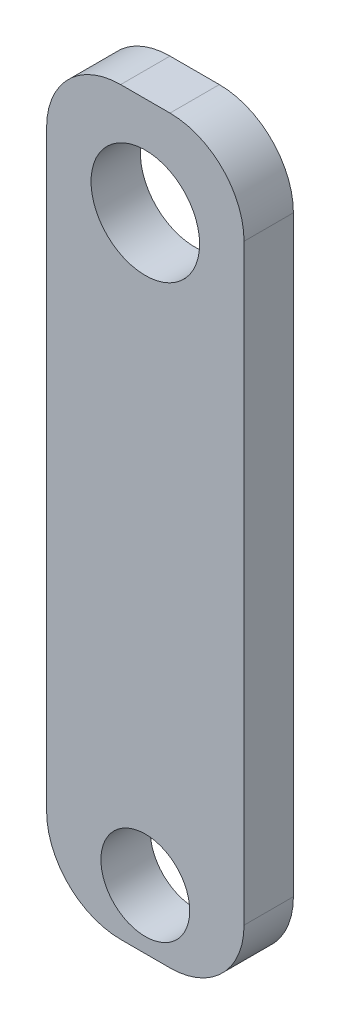
ISO-10303-21;
HEADER;
FILE_DESCRIPTION(('STEP AP214'),'2;1');
FILE_NAME('part.step','',(''),(''),'','','');
FILE_SCHEMA(('AUTOMOTIVE_DESIGN { 1 0 10303 214 1 1 1 1 }'));
ENDSEC;
DATA;
#1=APPLICATION_CONTEXT('core data for automotive mechanical design processes');
#2=APPLICATION_PROTOCOL_DEFINITION('international standard','automotive_design',2000,#1);
#3=PRODUCT_CONTEXT('',#1,'mechanical');
#4=PRODUCT('Part','Part','',(#3));
#5=PRODUCT_RELATED_PRODUCT_CATEGORY('part','',(#4));
#6=PRODUCT_DEFINITION_FORMATION('','',#4);
#7=PRODUCT_DEFINITION_CONTEXT('part definition',#1,'design');
#8=PRODUCT_DEFINITION('design','',#6,#7);
#9=PRODUCT_DEFINITION_SHAPE('','',#8);
#10=(LENGTH_UNIT() NAMED_UNIT(*) SI_UNIT(.MILLI.,.METRE.));
#11=(NAMED_UNIT(*) PLANE_ANGLE_UNIT() SI_UNIT($,.RADIAN.));
#12=(NAMED_UNIT(*) SI_UNIT($,.STERADIAN.) SOLID_ANGLE_UNIT());
#13=UNCERTAINTY_MEASURE_WITH_UNIT(LENGTH_MEASURE(1.E-05),#10,'distance_accuracy_value','');
#14=(GEOMETRIC_REPRESENTATION_CONTEXT(3) GLOBAL_UNCERTAINTY_ASSIGNED_CONTEXT((#13)) GLOBAL_UNIT_ASSIGNED_CONTEXT((#10,
#11,#12)) REPRESENTATION_CONTEXT('',''));
#15=CARTESIAN_POINT('',(0.,0.,0.));
#16=DIRECTION('',(0.,0.,1.));
#17=DIRECTION('',(1.,0.,0.));
#18=AXIS2_PLACEMENT_3D('',#15,#16,#17);
#19=CARTESIAN_POINT('',(20.,150.,-5.));
#20=DIRECTION('',(-1.,0.,0.));
#21=DIRECTION('',(0.,0.,1.));
#22=AXIS2_PLACEMENT_3D('',#19,#20,#21);
#23=PLANE('',#22);
#24=DIRECTION('',(0.,-1.,0.));
#25=VECTOR('',#24,1.);
#26=CARTESIAN_POINT('',(20.,150.,5.));
#27=LINE('',#26,#25);
#28=CARTESIAN_POINT('',(20.,135.,5.));
#29=VERTEX_POINT('',#28);
#30=CARTESIAN_POINT('',(20.,15.,5.));
#31=VERTEX_POINT('',#30);
#32=EDGE_CURVE('E121',#29,#31,#27,.T.);
#33=ORIENTED_EDGE('',*,*,#32,.T.);
#34=DIRECTION('',(0.,0.,-1.));
#35=VECTOR('',#34,1.);
#36=CARTESIAN_POINT('',(20.,15.,-5.));
#37=LINE('',#36,#35);
#38=CARTESIAN_POINT('',(20.,15.,-5.));
#39=VERTEX_POINT('',#38);
#40=EDGE_CURVE('E147',#31,#39,#37,.T.);
#41=ORIENTED_EDGE('',*,*,#40,.T.);
#42=DIRECTION('',(0.,-1.,0.));
#43=VECTOR('',#42,1.);
#44=CARTESIAN_POINT('',(20.,150.,-5.));
#45=LINE('',#44,#43);
#46=CARTESIAN_POINT('',(20.,135.,-5.));
#47=VERTEX_POINT('',#46);
#48=EDGE_CURVE('E126',#47,#39,#45,.T.);
#49=ORIENTED_EDGE('',*,*,#48,.F.);
#50=DIRECTION('',(0.,0.,-1.));
#51=VECTOR('',#50,1.);
#52=CARTESIAN_POINT('',(20.,135.,5.));
#53=LINE('',#52,#51);
#54=EDGE_CURVE('E145',#47,#29,#53,.F.);
#55=ORIENTED_EDGE('',*,*,#54,.T.);
#56=EDGE_LOOP('',(#33,#41,#49,#55));
#57=FACE_BOUND('',#56,.T.);
#58=ADVANCED_FACE('F33',(#57),#23,.F.);
#59=CARTESIAN_POINT('',(-20.,150.,-5.));
#60=DIRECTION('',(0.,0.,1.));
#61=DIRECTION('',(1.,0.,0.));
#62=AXIS2_PLACEMENT_3D('',#59,#60,#61);
#63=PLANE('',#62);
#64=CARTESIAN_POINT('',(0.,12.,-5.));
#65=DIRECTION('',(0.,0.,1.));
#66=DIRECTION('',(1.,0.,0.));
#67=AXIS2_PLACEMENT_3D('',#64,#65,#66);
#68=CIRCLE('',#67,9.);
#69=CARTESIAN_POINT('',(9.,12.,-5.));
#70=VERTEX_POINT('',#69);
#71=EDGE_CURVE('E291',#70,#70,#68,.T.);
#72=ORIENTED_EDGE('',*,*,#71,.T.);
#73=EDGE_LOOP('',(#72));
#74=FACE_BOUND('',#73,.T.);
#75=CARTESIAN_POINT('',(0.,130.,-5.));
#76=DIRECTION('',(0.,0.,1.));
#77=DIRECTION('',(1.,0.,0.));
#78=AXIS2_PLACEMENT_3D('',#75,#76,#77);
#79=CIRCLE('',#78,11.);
#80=CARTESIAN_POINT('',(11.,130.,-5.));
#81=VERTEX_POINT('',#80);
#82=EDGE_CURVE('E168',#81,#81,#79,.T.);
#83=ORIENTED_EDGE('',*,*,#82,.T.);
#84=EDGE_LOOP('',(#83));
#85=FACE_BOUND('',#84,.T.);
#86=DIRECTION('',(-1.,0.,0.));
#87=VECTOR('',#86,1.);
#88=CARTESIAN_POINT('',(-20.,0.,-5.));
#89=LINE('',#88,#87);
#90=CARTESIAN_POINT('',(5.,0.,-5.));
#91=VERTEX_POINT('',#90);
#92=CARTESIAN_POINT('',(-5.,0.,-5.));
#93=VERTEX_POINT('',#92);
#94=EDGE_CURVE('E162',#91,#93,#89,.T.);
#95=ORIENTED_EDGE('',*,*,#94,.T.);
#96=CARTESIAN_POINT('',(-5.,15.,-5.));
#97=DIRECTION('',(0.,0.,1.));
#98=DIRECTION('',(1.,0.,0.));
#99=AXIS2_PLACEMENT_3D('',#96,#97,#98);
#100=CIRCLE('',#99,15.);
#101=CARTESIAN_POINT('',(-20.,15.,-5.));
#102=VERTEX_POINT('',#101);
#103=EDGE_CURVE('E143',#93,#102,#100,.F.);
#104=ORIENTED_EDGE('',*,*,#103,.T.);
#105=DIRECTION('',(0.,-1.,0.));
#106=VECTOR('',#105,1.);
#107=CARTESIAN_POINT('',(-20.,150.,-5.));
#108=LINE('',#107,#106);
#109=CARTESIAN_POINT('',(-20.,135.,-5.));
#110=VERTEX_POINT('',#109);
#111=EDGE_CURVE('E120',#110,#102,#108,.T.);
#112=ORIENTED_EDGE('',*,*,#111,.F.);
#113=CARTESIAN_POINT('',(-5.,135.,-5.));
#114=DIRECTION('',(0.,0.,1.));
#115=DIRECTION('',(1.,0.,0.));
#116=AXIS2_PLACEMENT_3D('',#113,#114,#115);
#117=CIRCLE('',#116,15.);
#118=CARTESIAN_POINT('',(-5.,150.,-5.));
#119=VERTEX_POINT('',#118);
#120=EDGE_CURVE('E125',#110,#119,#117,.F.);
#121=ORIENTED_EDGE('',*,*,#120,.T.);
#122=DIRECTION('',(-1.,0.,0.));
#123=VECTOR('',#122,1.);
#124=CARTESIAN_POINT('',(-20.,150.,-5.));
#125=LINE('',#124,#123);
#126=CARTESIAN_POINT('',(5.,150.,-5.));
#127=VERTEX_POINT('',#126);
#128=EDGE_CURVE('E153',#127,#119,#125,.T.);
#129=ORIENTED_EDGE('',*,*,#128,.F.);
#130=CARTESIAN_POINT('',(5.,135.,-5.));
#131=DIRECTION('',(0.,0.,1.));
#132=DIRECTION('',(1.,0.,0.));
#133=AXIS2_PLACEMENT_3D('',#130,#131,#132);
#134=CIRCLE('',#133,15.);
#135=EDGE_CURVE('E56',#127,#47,#134,.F.);
#136=ORIENTED_EDGE('',*,*,#135,.T.);
#137=ORIENTED_EDGE('',*,*,#48,.T.);
#138=CARTESIAN_POINT('',(5.,15.,-5.));
#139=DIRECTION('',(0.,0.,1.));
#140=DIRECTION('',(1.,0.,0.));
#141=AXIS2_PLACEMENT_3D('',#138,#139,#140);
#142=CIRCLE('',#141,15.);
#143=EDGE_CURVE('E48',#39,#91,#142,.F.);
#144=ORIENTED_EDGE('',*,*,#143,.T.);
#145=EDGE_LOOP('',(#95,#104,#112,#121,#129,#136,#137,#144));
#146=FACE_BOUND('',#145,.T.);
#147=ADVANCED_FACE('F157',(#74,#85,#146),#63,.F.);
#148=CARTESIAN_POINT('',(-20.,150.,-5.));
#149=DIRECTION('',(1.,0.,0.));
#150=DIRECTION('',(0.,0.,-1.));
#151=AXIS2_PLACEMENT_3D('',#148,#149,#150);
#152=PLANE('',#151);
#153=ORIENTED_EDGE('',*,*,#111,.T.);
#154=DIRECTION('',(0.,0.,1.));
#155=VECTOR('',#154,1.);
#156=CARTESIAN_POINT('',(-20.,15.,-5.));
#157=LINE('',#156,#155);
#158=CARTESIAN_POINT('',(-20.,15.,5.));
#159=VERTEX_POINT('',#158);
#160=EDGE_CURVE('E119',#102,#159,#157,.T.);
#161=ORIENTED_EDGE('',*,*,#160,.T.);
#162=DIRECTION('',(0.,-1.,0.));
#163=VECTOR('',#162,1.);
#164=CARTESIAN_POINT('',(-20.,150.,5.));
#165=LINE('',#164,#163);
#166=CARTESIAN_POINT('',(-20.,135.,5.));
#167=VERTEX_POINT('',#166);
#168=EDGE_CURVE('E103',#167,#159,#165,.T.);
#169=ORIENTED_EDGE('',*,*,#168,.F.);
#170=DIRECTION('',(0.,0.,1.));
#171=VECTOR('',#170,1.);
#172=CARTESIAN_POINT('',(-20.,135.,-5.));
#173=LINE('',#172,#171);
#174=EDGE_CURVE('E116',#167,#110,#173,.F.);
#175=ORIENTED_EDGE('',*,*,#174,.T.);
#176=EDGE_LOOP('',(#153,#161,#169,#175));
#177=FACE_BOUND('',#176,.T.);
#178=ADVANCED_FACE('F115',(#177),#152,.F.);
#179=CARTESIAN_POINT('',(-20.,150.,5.));
#180=DIRECTION('',(0.,0.,-1.));
#181=DIRECTION('',(-1.,0.,0.));
#182=AXIS2_PLACEMENT_3D('',#179,#180,#181);
#183=PLANE('',#182);
#184=CARTESIAN_POINT('',(0.,12.,5.));
#185=DIRECTION('',(0.,0.,1.));
#186=DIRECTION('',(1.,0.,0.));
#187=AXIS2_PLACEMENT_3D('',#184,#185,#186);
#188=CIRCLE('',#187,9.);
#189=CARTESIAN_POINT('',(9.,12.,5.));
#190=VERTEX_POINT('',#189);
#191=EDGE_CURVE('E287',#190,#190,#188,.T.);
#192=ORIENTED_EDGE('',*,*,#191,.F.);
#193=EDGE_LOOP('',(#192));
#194=FACE_BOUND('',#193,.T.);
#195=CARTESIAN_POINT('',(0.,130.,5.));
#196=DIRECTION('',(0.,0.,1.));
#197=DIRECTION('',(1.,0.,0.));
#198=AXIS2_PLACEMENT_3D('',#195,#196,#197);
#199=CIRCLE('',#198,11.);
#200=CARTESIAN_POINT('',(11.,130.,5.));
#201=VERTEX_POINT('',#200);
#202=EDGE_CURVE('E165',#201,#201,#199,.T.);
#203=ORIENTED_EDGE('',*,*,#202,.F.);
#204=EDGE_LOOP('',(#203));
#205=FACE_BOUND('',#204,.T.);
#206=ORIENTED_EDGE('',*,*,#168,.T.);
#207=CARTESIAN_POINT('',(-5.,15.,5.));
#208=DIRECTION('',(0.,0.,-1.));
#209=DIRECTION('',(-1.,0.,0.));
#210=AXIS2_PLACEMENT_3D('',#207,#208,#209);
#211=CIRCLE('',#210,15.);
#212=CARTESIAN_POINT('',(-5.,0.,5.));
#213=VERTEX_POINT('',#212);
#214=EDGE_CURVE('E134',#159,#213,#211,.F.);
#215=ORIENTED_EDGE('',*,*,#214,.T.);
#216=DIRECTION('',(1.,0.,0.));
#217=VECTOR('',#216,1.);
#218=CARTESIAN_POINT('',(-20.,0.,5.));
#219=LINE('',#218,#217);
#220=CARTESIAN_POINT('',(5.,0.,5.));
#221=VERTEX_POINT('',#220);
#222=EDGE_CURVE('E158',#213,#221,#219,.T.);
#223=ORIENTED_EDGE('',*,*,#222,.T.);
#224=CARTESIAN_POINT('',(5.,15.,5.));
#225=DIRECTION('',(0.,0.,-1.));
#226=DIRECTION('',(-1.,0.,0.));
#227=AXIS2_PLACEMENT_3D('',#224,#225,#226);
#228=CIRCLE('',#227,15.);
#229=EDGE_CURVE('E109',#221,#31,#228,.F.);
#230=ORIENTED_EDGE('',*,*,#229,.T.);
#231=ORIENTED_EDGE('',*,*,#32,.F.);
#232=CARTESIAN_POINT('',(5.,135.,5.));
#233=DIRECTION('',(0.,0.,-1.));
#234=DIRECTION('',(-1.,0.,0.));
#235=AXIS2_PLACEMENT_3D('',#232,#233,#234);
#236=CIRCLE('',#235,15.);
#237=CARTESIAN_POINT('',(5.,150.,5.));
#238=VERTEX_POINT('',#237);
#239=EDGE_CURVE('E110',#29,#238,#236,.F.);
#240=ORIENTED_EDGE('',*,*,#239,.T.);
#241=DIRECTION('',(1.,0.,0.));
#242=VECTOR('',#241,1.);
#243=CARTESIAN_POINT('',(-20.,150.,5.));
#244=LINE('',#243,#242);
#245=CARTESIAN_POINT('',(-5.,150.,5.));
#246=VERTEX_POINT('',#245);
#247=EDGE_CURVE('E105',#246,#238,#244,.T.);
#248=ORIENTED_EDGE('',*,*,#247,.F.);
#249=CARTESIAN_POINT('',(-5.,135.,5.));
#250=DIRECTION('',(0.,0.,-1.));
#251=DIRECTION('',(-1.,0.,0.));
#252=AXIS2_PLACEMENT_3D('',#249,#250,#251);
#253=CIRCLE('',#252,15.);
#254=EDGE_CURVE('E100',#246,#167,#253,.F.);
#255=ORIENTED_EDGE('',*,*,#254,.T.);
#256=EDGE_LOOP('',(#206,#215,#223,#230,#231,#240,#248,#255));
#257=FACE_BOUND('',#256,.T.);
#258=ADVANCED_FACE('F102',(#194,#205,#257),#183,.F.);
#259=CARTESIAN_POINT('',(0.,150.,0.));
#260=DIRECTION('',(0.,1.,0.));
#261=DIRECTION('',(0.,0.,1.));
#262=AXIS2_PLACEMENT_3D('',#259,#260,#261);
#263=PLANE('',#262);
#264=ORIENTED_EDGE('',*,*,#128,.T.);
#265=DIRECTION('',(0.,0.,1.));
#266=VECTOR('',#265,1.);
#267=CARTESIAN_POINT('',(-5.,150.,5.));
#268=LINE('',#267,#266);
#269=EDGE_CURVE('E11',#119,#246,#268,.T.);
#270=ORIENTED_EDGE('',*,*,#269,.T.);
#271=ORIENTED_EDGE('',*,*,#247,.T.);
#272=DIRECTION('',(0.,0.,-1.));
#273=VECTOR('',#272,1.);
#274=CARTESIAN_POINT('',(5.,150.,-5.));
#275=LINE('',#274,#273);
#276=EDGE_CURVE('E41',#238,#127,#275,.T.);
#277=ORIENTED_EDGE('',*,*,#276,.T.);
#278=EDGE_LOOP('',(#264,#270,#271,#277));
#279=FACE_BOUND('',#278,.T.);
#280=ADVANCED_FACE('F152',(#279),#263,.T.);
#281=CARTESIAN_POINT('',(0.,0.,0.));
#282=DIRECTION('',(0.,1.,0.));
#283=DIRECTION('',(0.,0.,1.));
#284=AXIS2_PLACEMENT_3D('',#281,#282,#283);
#285=PLANE('',#284);
#286=ORIENTED_EDGE('',*,*,#222,.F.);
#287=DIRECTION('',(0.,0.,1.));
#288=VECTOR('',#287,1.);
#289=CARTESIAN_POINT('',(-5.,0.,0.));
#290=LINE('',#289,#288);
#291=EDGE_CURVE('E138',#213,#93,#290,.F.);
#292=ORIENTED_EDGE('',*,*,#291,.T.);
#293=ORIENTED_EDGE('',*,*,#94,.F.);
#294=DIRECTION('',(0.,0.,-1.));
#295=VECTOR('',#294,1.);
#296=CARTESIAN_POINT('',(5.,0.,0.));
#297=LINE('',#296,#295);
#298=EDGE_CURVE('E136',#91,#221,#297,.F.);
#299=ORIENTED_EDGE('',*,*,#298,.T.);
#300=EDGE_LOOP('',(#286,#292,#293,#299));
#301=FACE_BOUND('',#300,.T.);
#302=ADVANCED_FACE('F178',(#301),#285,.F.);
#303=CARTESIAN_POINT('',(0.,130.,-5.));
#304=DIRECTION('',(0.,0.,1.));
#305=DIRECTION('',(1.,0.,0.));
#306=AXIS2_PLACEMENT_3D('',#303,#304,#305);
#307=CYLINDRICAL_SURFACE('',#306,11.);
#308=ORIENTED_EDGE('',*,*,#82,.F.);
#309=EDGE_LOOP('',(#308));
#310=FACE_BOUND('',#309,.T.);
#311=ORIENTED_EDGE('',*,*,#202,.T.);
#312=EDGE_LOOP('',(#311));
#313=FACE_BOUND('',#312,.T.);
#314=ADVANCED_FACE('F230',(#310,#313),#307,.F.);
#315=CARTESIAN_POINT('',(0.,12.,-5.));
#316=DIRECTION('',(0.,0.,1.));
#317=DIRECTION('',(1.,0.,0.));
#318=AXIS2_PLACEMENT_3D('',#315,#316,#317);
#319=CYLINDRICAL_SURFACE('',#318,9.);
#320=ORIENTED_EDGE('',*,*,#71,.F.);
#321=EDGE_LOOP('',(#320));
#322=FACE_BOUND('',#321,.T.);
#323=ORIENTED_EDGE('',*,*,#191,.T.);
#324=EDGE_LOOP('',(#323));
#325=FACE_BOUND('',#324,.T.);
#326=ADVANCED_FACE('F199',(#322,#325),#319,.F.);
#327=CARTESIAN_POINT('',(-5.,15.,-5.));
#328=DIRECTION('',(0.,0.,1.));
#329=DIRECTION('',(1.,0.,0.));
#330=AXIS2_PLACEMENT_3D('',#327,#328,#329);
#331=CYLINDRICAL_SURFACE('',#330,15.);
#332=ORIENTED_EDGE('',*,*,#103,.F.);
#333=ORIENTED_EDGE('',*,*,#291,.F.);
#334=ORIENTED_EDGE('',*,*,#214,.F.);
#335=ORIENTED_EDGE('',*,*,#160,.F.);
#336=EDGE_LOOP('',(#332,#333,#334,#335));
#337=FACE_BOUND('',#336,.T.);
#338=ADVANCED_FACE('F173',(#337),#331,.T.);
#339=CARTESIAN_POINT('',(5.,15.,-5.));
#340=DIRECTION('',(0.,0.,-1.));
#341=DIRECTION('',(-1.,0.,0.));
#342=AXIS2_PLACEMENT_3D('',#339,#340,#341);
#343=CYLINDRICAL_SURFACE('',#342,15.);
#344=ORIENTED_EDGE('',*,*,#229,.F.);
#345=ORIENTED_EDGE('',*,*,#298,.F.);
#346=ORIENTED_EDGE('',*,*,#143,.F.);
#347=ORIENTED_EDGE('',*,*,#40,.F.);
#348=EDGE_LOOP('',(#344,#345,#346,#347));
#349=FACE_BOUND('',#348,.T.);
#350=ADVANCED_FACE('F180',(#349),#343,.T.);
#351=CARTESIAN_POINT('',(-5.,135.,0.));
#352=DIRECTION('',(0.,0.,-1.));
#353=DIRECTION('',(-1.,0.,0.));
#354=AXIS2_PLACEMENT_3D('',#351,#352,#353);
#355=CYLINDRICAL_SURFACE('',#354,15.);
#356=ORIENTED_EDGE('',*,*,#120,.F.);
#357=ORIENTED_EDGE('',*,*,#174,.F.);
#358=ORIENTED_EDGE('',*,*,#254,.F.);
#359=ORIENTED_EDGE('',*,*,#269,.F.);
#360=EDGE_LOOP('',(#356,#357,#358,#359));
#361=FACE_BOUND('',#360,.T.);
#362=ADVANCED_FACE('F124',(#361),#355,.T.);
#363=CARTESIAN_POINT('',(5.,135.,0.));
#364=DIRECTION('',(0.,0.,1.));
#365=DIRECTION('',(1.,0.,0.));
#366=AXIS2_PLACEMENT_3D('',#363,#364,#365);
#367=CYLINDRICAL_SURFACE('',#366,15.);
#368=ORIENTED_EDGE('',*,*,#239,.F.);
#369=ORIENTED_EDGE('',*,*,#54,.F.);
#370=ORIENTED_EDGE('',*,*,#135,.F.);
#371=ORIENTED_EDGE('',*,*,#276,.F.);
#372=EDGE_LOOP('',(#368,#369,#370,#371));
#373=FACE_BOUND('',#372,.T.);
#374=ADVANCED_FACE('F35',(#373),#367,.T.);
#375=CLOSED_SHELL('',(#58,#147,#178,#258,#280,#302,#314,#326,#338,#350,#362,#374));
#376=MANIFOLD_SOLID_BREP('B2',#375);
#377=ADVANCED_BREP_SHAPE_REPRESENTATION('',(#18,#376),#14);
#378=SHAPE_DEFINITION_REPRESENTATION(#9,#377);
ENDSEC;
END-ISO-10303-21;
